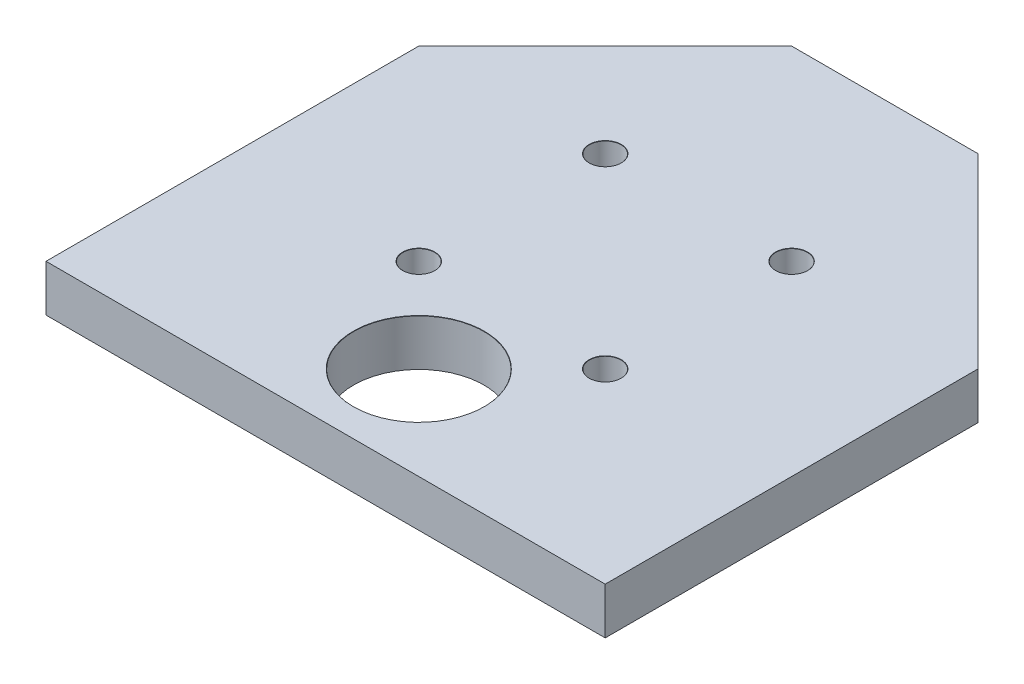
ISO-10303-21;
HEADER;
FILE_DESCRIPTION(('STEP AP214'),'2;1');
FILE_NAME('part.step','',(''),(''),'','','');
FILE_SCHEMA(('AUTOMOTIVE_DESIGN { 1 0 10303 214 1 1 1 1 }'));
ENDSEC;
DATA;
#1=APPLICATION_CONTEXT('core data for automotive mechanical design processes');
#2=APPLICATION_PROTOCOL_DEFINITION('international standard','automotive_design',2000,#1);
#3=PRODUCT_CONTEXT('',#1,'mechanical');
#4=PRODUCT('Part','Part','',(#3));
#5=PRODUCT_RELATED_PRODUCT_CATEGORY('part','',(#4));
#6=PRODUCT_DEFINITION_FORMATION('','',#4);
#7=PRODUCT_DEFINITION_CONTEXT('part definition',#1,'design');
#8=PRODUCT_DEFINITION('design','',#6,#7);
#9=PRODUCT_DEFINITION_SHAPE('','',#8);
#10=(LENGTH_UNIT() NAMED_UNIT(*) SI_UNIT(.MILLI.,.METRE.));
#11=(NAMED_UNIT(*) PLANE_ANGLE_UNIT() SI_UNIT($,.RADIAN.));
#12=(NAMED_UNIT(*) SI_UNIT($,.STERADIAN.) SOLID_ANGLE_UNIT());
#13=UNCERTAINTY_MEASURE_WITH_UNIT(LENGTH_MEASURE(1.E-05),#10,'distance_accuracy_value','');
#14=(GEOMETRIC_REPRESENTATION_CONTEXT(3) GLOBAL_UNCERTAINTY_ASSIGNED_CONTEXT((#13)) GLOBAL_UNIT_ASSIGNED_CONTEXT((#10,
#11,#12)) REPRESENTATION_CONTEXT('',''));
#15=CARTESIAN_POINT('',(0.,0.,0.));
#16=DIRECTION('',(0.,0.,1.));
#17=DIRECTION('',(1.,0.,0.));
#18=AXIS2_PLACEMENT_3D('',#15,#16,#17);
#19=CARTESIAN_POINT('',(-30.,5.,30.));
#20=DIRECTION('',(1.,0.,0.));
#21=DIRECTION('',(0.,0.,-1.));
#22=AXIS2_PLACEMENT_3D('',#19,#20,#21);
#23=PLANE('',#22);
#24=DIRECTION('',(0.,0.,1.));
#25=VECTOR('',#24,1.);
#26=CARTESIAN_POINT('',(-30.,0.,30.));
#27=LINE('',#26,#25);
#28=CARTESIAN_POINT('',(-30.,0.,-10.0000000000002));
#29=VERTEX_POINT('',#28);
#30=CARTESIAN_POINT('',(-30.,0.,30.));
#31=VERTEX_POINT('',#30);
#32=EDGE_CURVE('E135',#29,#31,#27,.T.);
#33=ORIENTED_EDGE('',*,*,#32,.T.);
#34=DIRECTION('',(0.,-1.,0.));
#35=VECTOR('',#34,1.);
#36=CARTESIAN_POINT('',(-30.,5.,30.));
#37=LINE('',#36,#35);
#38=CARTESIAN_POINT('',(-30.,5.,30.));
#39=VERTEX_POINT('',#38);
#40=EDGE_CURVE('E11',#39,#31,#37,.T.);
#41=ORIENTED_EDGE('',*,*,#40,.F.);
#42=DIRECTION('',(0.,0.,1.));
#43=VECTOR('',#42,1.);
#44=CARTESIAN_POINT('',(-30.,5.,30.));
#45=LINE('',#44,#43);
#46=CARTESIAN_POINT('',(-30.,5.,-10.0000000000002));
#47=VERTEX_POINT('',#46);
#48=EDGE_CURVE('E152',#47,#39,#45,.T.);
#49=ORIENTED_EDGE('',*,*,#48,.F.);
#50=DIRECTION('',(0.,-1.,0.));
#51=VECTOR('',#50,1.);
#52=CARTESIAN_POINT('',(-30.,5.,-10.0000000000002));
#53=LINE('',#52,#51);
#54=EDGE_CURVE('E131',#47,#29,#53,.T.);
#55=ORIENTED_EDGE('',*,*,#54,.T.);
#56=EDGE_LOOP('',(#33,#41,#49,#55));
#57=FACE_BOUND('',#56,.T.);
#58=ADVANCED_FACE('F42',(#57),#23,.F.);
#59=CARTESIAN_POINT('',(-30.,5.,30.));
#60=DIRECTION('',(0.,0.,-1.));
#61=DIRECTION('',(-1.,0.,0.));
#62=AXIS2_PLACEMENT_3D('',#59,#60,#61);
#63=PLANE('',#62);
#64=DIRECTION('',(1.,0.,0.));
#65=VECTOR('',#64,1.);
#66=CARTESIAN_POINT('',(-30.,0.,30.));
#67=LINE('',#66,#65);
#68=CARTESIAN_POINT('',(30.,0.,30.));
#69=VERTEX_POINT('',#68);
#70=EDGE_CURVE('E139',#31,#69,#67,.T.);
#71=ORIENTED_EDGE('',*,*,#70,.T.);
#72=DIRECTION('',(0.,-1.,0.));
#73=VECTOR('',#72,1.);
#74=CARTESIAN_POINT('',(30.,5.,30.));
#75=LINE('',#74,#73);
#76=CARTESIAN_POINT('',(30.,5.,30.));
#77=VERTEX_POINT('',#76);
#78=EDGE_CURVE('E51',#77,#69,#75,.T.);
#79=ORIENTED_EDGE('',*,*,#78,.F.);
#80=DIRECTION('',(1.,0.,0.));
#81=VECTOR('',#80,1.);
#82=CARTESIAN_POINT('',(-30.,5.,30.));
#83=LINE('',#82,#81);
#84=EDGE_CURVE('E97',#39,#77,#83,.T.);
#85=ORIENTED_EDGE('',*,*,#84,.F.);
#86=ORIENTED_EDGE('',*,*,#40,.T.);
#87=EDGE_LOOP('',(#71,#79,#85,#86));
#88=FACE_BOUND('',#87,.T.);
#89=ADVANCED_FACE('F184',(#88),#63,.F.);
#90=CARTESIAN_POINT('',(30.,5.,30.));
#91=DIRECTION('',(-1.,0.,0.));
#92=DIRECTION('',(0.,0.,1.));
#93=AXIS2_PLACEMENT_3D('',#90,#91,#92);
#94=PLANE('',#93);
#95=DIRECTION('',(0.,0.,-1.));
#96=VECTOR('',#95,1.);
#97=CARTESIAN_POINT('',(30.,0.,30.));
#98=LINE('',#97,#96);
#99=CARTESIAN_POINT('',(30.,0.,-10.0000000000002));
#100=VERTEX_POINT('',#99);
#101=EDGE_CURVE('E143',#69,#100,#98,.T.);
#102=ORIENTED_EDGE('',*,*,#101,.T.);
#103=DIRECTION('',(0.,-1.,0.));
#104=VECTOR('',#103,1.);
#105=CARTESIAN_POINT('',(30.,5.,-10.0000000000002));
#106=LINE('',#105,#104);
#107=CARTESIAN_POINT('',(30.,5.,-10.0000000000002));
#108=VERTEX_POINT('',#107);
#109=EDGE_CURVE('E123',#108,#100,#106,.T.);
#110=ORIENTED_EDGE('',*,*,#109,.F.);
#111=DIRECTION('',(0.,0.,-1.));
#112=VECTOR('',#111,1.);
#113=CARTESIAN_POINT('',(30.,5.,30.));
#114=LINE('',#113,#112);
#115=EDGE_CURVE('E112',#77,#108,#114,.T.);
#116=ORIENTED_EDGE('',*,*,#115,.F.);
#117=ORIENTED_EDGE('',*,*,#78,.T.);
#118=EDGE_LOOP('',(#102,#110,#116,#117));
#119=FACE_BOUND('',#118,.T.);
#120=ADVANCED_FACE('F163',(#119),#94,.F.);
#121=CARTESIAN_POINT('',(9.99999999999999,5.,-30.));
#122=DIRECTION('',(-0.707106781186544,0.,0.707106781186551));
#123=DIRECTION('',(0.707106781186551,0.,0.707106781186544));
#124=AXIS2_PLACEMENT_3D('',#121,#122,#123);
#125=PLANE('',#124);
#126=CARTESIAN_POINT('',(15.6568542494924,2.5,-24.3431457505076));
#127=DIRECTION('',(0.707106781186544,0.,-0.707106781186551));
#128=DIRECTION('',(-0.707106781186551,0.,-0.707106781186544));
#129=AXIS2_PLACEMENT_3D('',#126,#127,#128);
#130=CIRCLE('',#129,1.275);
#131=CARTESIAN_POINT('',(14.7552931034796,2.5,-25.2447068965205));
#132=VERTEX_POINT('',#131);
#133=EDGE_CURVE('E199',#132,#132,#130,.T.);
#134=ORIENTED_EDGE('',*,*,#133,.F.);
#135=EDGE_LOOP('',(#134));
#136=FACE_BOUND('',#135,.T.);
#137=DIRECTION('',(-0.707106781186551,0.,-0.707106781186544));
#138=VECTOR('',#137,1.);
#139=CARTESIAN_POINT('',(9.99999999999999,0.,-30.));
#140=LINE('',#139,#138);
#141=CARTESIAN_POINT('',(9.99999999999999,0.,-30.));
#142=VERTEX_POINT('',#141);
#143=EDGE_CURVE('E121',#100,#142,#140,.T.);
#144=ORIENTED_EDGE('',*,*,#143,.T.);
#145=DIRECTION('',(0.,-1.,0.));
#146=VECTOR('',#145,1.);
#147=CARTESIAN_POINT('',(9.99999999999999,5.,-30.));
#148=LINE('',#147,#146);
#149=CARTESIAN_POINT('',(9.99999999999999,5.,-30.));
#150=VERTEX_POINT('',#149);
#151=EDGE_CURVE('E118',#150,#142,#148,.T.);
#152=ORIENTED_EDGE('',*,*,#151,.F.);
#153=DIRECTION('',(-0.707106781186551,0.,-0.707106781186544));
#154=VECTOR('',#153,1.);
#155=CARTESIAN_POINT('',(9.99999999999999,5.,-30.));
#156=LINE('',#155,#154);
#157=EDGE_CURVE('E106',#108,#150,#156,.T.);
#158=ORIENTED_EDGE('',*,*,#157,.F.);
#159=ORIENTED_EDGE('',*,*,#109,.T.);
#160=EDGE_LOOP('',(#144,#152,#158,#159));
#161=FACE_BOUND('',#160,.T.);
#162=ADVANCED_FACE('F119',(#136,#161),#125,.F.);
#163=CARTESIAN_POINT('',(-10.,5.,-30.));
#164=DIRECTION('',(0.,0.,1.));
#165=DIRECTION('',(1.,0.,0.));
#166=AXIS2_PLACEMENT_3D('',#163,#164,#165);
#167=PLANE('',#166);
#168=DIRECTION('',(-1.,0.,0.));
#169=VECTOR('',#168,1.);
#170=CARTESIAN_POINT('',(-10.,0.,-30.));
#171=LINE('',#170,#169);
#172=CARTESIAN_POINT('',(-10.,0.,-30.));
#173=VERTEX_POINT('',#172);
#174=EDGE_CURVE('E83',#142,#173,#171,.T.);
#175=ORIENTED_EDGE('',*,*,#174,.T.);
#176=DIRECTION('',(0.,-1.,0.));
#177=VECTOR('',#176,1.);
#178=CARTESIAN_POINT('',(-10.,5.,-30.));
#179=LINE('',#178,#177);
#180=CARTESIAN_POINT('',(-10.,5.,-30.));
#181=VERTEX_POINT('',#180);
#182=EDGE_CURVE('E124',#181,#173,#179,.T.);
#183=ORIENTED_EDGE('',*,*,#182,.F.);
#184=DIRECTION('',(-1.,0.,0.));
#185=VECTOR('',#184,1.);
#186=CARTESIAN_POINT('',(-10.,5.,-30.));
#187=LINE('',#186,#185);
#188=EDGE_CURVE('E110',#150,#181,#187,.T.);
#189=ORIENTED_EDGE('',*,*,#188,.F.);
#190=ORIENTED_EDGE('',*,*,#151,.T.);
#191=EDGE_LOOP('',(#175,#183,#189,#190));
#192=FACE_BOUND('',#191,.T.);
#193=ADVANCED_FACE('F126',(#192),#167,.F.);
#194=CARTESIAN_POINT('',(-10.,5.,-30.));
#195=DIRECTION('',(0.707106781186544,0.,0.707106781186551));
#196=DIRECTION('',(0.707106781186551,0.,-0.707106781186544));
#197=AXIS2_PLACEMENT_3D('',#194,#195,#196);
#198=PLANE('',#197);
#199=CARTESIAN_POINT('',(-15.6568542494924,2.5,-24.3431457505076));
#200=DIRECTION('',(-0.707106781186544,0.,-0.707106781186551));
#201=DIRECTION('',(-0.707106781186551,0.,0.707106781186544));
#202=AXIS2_PLACEMENT_3D('',#199,#200,#201);
#203=CIRCLE('',#202,1.275);
#204=CARTESIAN_POINT('',(-16.5584153955053,2.5,-23.4415846044948));
#205=VERTEX_POINT('',#204);
#206=EDGE_CURVE('E231',#205,#205,#203,.T.);
#207=ORIENTED_EDGE('',*,*,#206,.F.);
#208=EDGE_LOOP('',(#207));
#209=FACE_BOUND('',#208,.T.);
#210=DIRECTION('',(-0.707106781186551,0.,0.707106781186544));
#211=VECTOR('',#210,1.);
#212=CARTESIAN_POINT('',(-10.,0.,-30.));
#213=LINE('',#212,#211);
#214=EDGE_CURVE('E89',#173,#29,#213,.T.);
#215=ORIENTED_EDGE('',*,*,#214,.T.);
#216=ORIENTED_EDGE('',*,*,#54,.F.);
#217=DIRECTION('',(-0.707106781186551,0.,0.707106781186544));
#218=VECTOR('',#217,1.);
#219=CARTESIAN_POINT('',(-10.,5.,-30.));
#220=LINE('',#219,#218);
#221=EDGE_CURVE('E59',#181,#47,#220,.T.);
#222=ORIENTED_EDGE('',*,*,#221,.F.);
#223=ORIENTED_EDGE('',*,*,#182,.T.);
#224=EDGE_LOOP('',(#215,#216,#222,#223));
#225=FACE_BOUND('',#224,.T.);
#226=ADVANCED_FACE('F170',(#209,#225),#198,.F.);
#227=CARTESIAN_POINT('',(0.,5.,0.));
#228=DIRECTION('',(0.,-1.,0.));
#229=DIRECTION('',(0.,0.,-1.));
#230=AXIS2_PLACEMENT_3D('',#227,#228,#229);
#231=PLANE('',#230);
#232=CARTESIAN_POINT('',(-10.,5.,-10.));
#233=DIRECTION('',(0.,1.,0.));
#234=DIRECTION('',(0.,0.,1.));
#235=AXIS2_PLACEMENT_3D('',#232,#233,#234);
#236=CIRCLE('',#235,1.725);
#237=CARTESIAN_POINT('',(-10.,5.,-8.275));
#238=VERTEX_POINT('',#237);
#239=EDGE_CURVE('E369',#238,#238,#236,.T.);
#240=ORIENTED_EDGE('',*,*,#239,.F.);
#241=EDGE_LOOP('',(#240));
#242=FACE_BOUND('',#241,.T.);
#243=CARTESIAN_POINT('',(10.,5.,-10.));
#244=DIRECTION('',(0.,1.,0.));
#245=DIRECTION('',(0.,0.,1.));
#246=AXIS2_PLACEMENT_3D('',#243,#244,#245);
#247=CIRCLE('',#246,1.725);
#248=CARTESIAN_POINT('',(10.,5.,-8.275));
#249=VERTEX_POINT('',#248);
#250=EDGE_CURVE('E378',#249,#249,#247,.T.);
#251=ORIENTED_EDGE('',*,*,#250,.F.);
#252=EDGE_LOOP('',(#251));
#253=FACE_BOUND('',#252,.T.);
#254=CARTESIAN_POINT('',(10.,5.,10.));
#255=DIRECTION('',(0.,1.,0.));
#256=DIRECTION('',(0.,0.,1.));
#257=AXIS2_PLACEMENT_3D('',#254,#255,#256);
#258=CIRCLE('',#257,1.725);
#259=CARTESIAN_POINT('',(10.,5.,11.725));
#260=VERTEX_POINT('',#259);
#261=EDGE_CURVE('E388',#260,#260,#258,.T.);
#262=ORIENTED_EDGE('',*,*,#261,.F.);
#263=EDGE_LOOP('',(#262));
#264=FACE_BOUND('',#263,.T.);
#265=CARTESIAN_POINT('',(-10.,5.,10.));
#266=DIRECTION('',(0.,1.,0.));
#267=DIRECTION('',(0.,0.,1.));
#268=AXIS2_PLACEMENT_3D('',#265,#266,#267);
#269=CIRCLE('',#268,1.725);
#270=CARTESIAN_POINT('',(-10.,5.,11.725));
#271=VERTEX_POINT('',#270);
#272=EDGE_CURVE('E398',#271,#271,#269,.T.);
#273=ORIENTED_EDGE('',*,*,#272,.F.);
#274=EDGE_LOOP('',(#273));
#275=FACE_BOUND('',#274,.T.);
#276=CARTESIAN_POINT('',(0.,5.,20.));
#277=DIRECTION('',(0.,1.,0.));
#278=DIRECTION('',(0.,0.,1.));
#279=AXIS2_PLACEMENT_3D('',#276,#277,#278);
#280=CIRCLE('',#279,7.025);
#281=CARTESIAN_POINT('',(0.,5.,27.025));
#282=VERTEX_POINT('',#281);
#283=EDGE_CURVE('E219',#282,#282,#280,.T.);
#284=ORIENTED_EDGE('',*,*,#283,.F.);
#285=EDGE_LOOP('',(#284));
#286=FACE_BOUND('',#285,.T.);
#287=ORIENTED_EDGE('',*,*,#48,.T.);
#288=ORIENTED_EDGE('',*,*,#84,.T.);
#289=ORIENTED_EDGE('',*,*,#115,.T.);
#290=ORIENTED_EDGE('',*,*,#157,.T.);
#291=ORIENTED_EDGE('',*,*,#188,.T.);
#292=ORIENTED_EDGE('',*,*,#221,.T.);
#293=EDGE_LOOP('',(#287,#288,#289,#290,#291,#292));
#294=FACE_BOUND('',#293,.T.);
#295=ADVANCED_FACE('F108',(#242,#253,#264,#275,#286,#294),#231,.F.);
#296=CARTESIAN_POINT('',(0.,0.,0.));
#297=DIRECTION('',(0.,-1.,0.));
#298=DIRECTION('',(0.,0.,-1.));
#299=AXIS2_PLACEMENT_3D('',#296,#297,#298);
#300=PLANE('',#299);
#301=CARTESIAN_POINT('',(-10.,0.,-10.));
#302=DIRECTION('',(0.,1.,0.));
#303=DIRECTION('',(0.,0.,1.));
#304=AXIS2_PLACEMENT_3D('',#301,#302,#303);
#305=CIRCLE('',#304,1.7);
#306=CARTESIAN_POINT('',(-10.,0.,-8.3));
#307=VERTEX_POINT('',#306);
#308=EDGE_CURVE('E296',#307,#307,#305,.T.);
#309=ORIENTED_EDGE('',*,*,#308,.T.);
#310=EDGE_LOOP('',(#309));
#311=FACE_BOUND('',#310,.T.);
#312=CARTESIAN_POINT('',(10.,0.,-10.));
#313=DIRECTION('',(0.,1.,0.));
#314=DIRECTION('',(0.,0.,1.));
#315=AXIS2_PLACEMENT_3D('',#312,#313,#314);
#316=CIRCLE('',#315,1.7);
#317=CARTESIAN_POINT('',(10.,0.,-8.3));
#318=VERTEX_POINT('',#317);
#319=EDGE_CURVE('E300',#318,#318,#316,.T.);
#320=ORIENTED_EDGE('',*,*,#319,.T.);
#321=EDGE_LOOP('',(#320));
#322=FACE_BOUND('',#321,.T.);
#323=CARTESIAN_POINT('',(10.,0.,10.));
#324=DIRECTION('',(0.,1.,0.));
#325=DIRECTION('',(0.,0.,1.));
#326=AXIS2_PLACEMENT_3D('',#323,#324,#325);
#327=CIRCLE('',#326,1.7);
#328=CARTESIAN_POINT('',(10.,0.,11.7));
#329=VERTEX_POINT('',#328);
#330=EDGE_CURVE('E304',#329,#329,#327,.T.);
#331=ORIENTED_EDGE('',*,*,#330,.T.);
#332=EDGE_LOOP('',(#331));
#333=FACE_BOUND('',#332,.T.);
#334=CARTESIAN_POINT('',(-10.,0.,10.));
#335=DIRECTION('',(0.,1.,0.));
#336=DIRECTION('',(0.,0.,1.));
#337=AXIS2_PLACEMENT_3D('',#334,#335,#336);
#338=CIRCLE('',#337,1.7);
#339=CARTESIAN_POINT('',(-10.,0.,11.7));
#340=VERTEX_POINT('',#339);
#341=EDGE_CURVE('E203',#340,#340,#338,.T.);
#342=ORIENTED_EDGE('',*,*,#341,.T.);
#343=EDGE_LOOP('',(#342));
#344=FACE_BOUND('',#343,.T.);
#345=CARTESIAN_POINT('',(0.,0.,20.));
#346=DIRECTION('',(0.,1.,0.));
#347=DIRECTION('',(0.,0.,1.));
#348=AXIS2_PLACEMENT_3D('',#345,#346,#347);
#349=CIRCLE('',#348,7.);
#350=CARTESIAN_POINT('',(0.,0.,27.));
#351=VERTEX_POINT('',#350);
#352=EDGE_CURVE('E227',#351,#351,#349,.T.);
#353=ORIENTED_EDGE('',*,*,#352,.T.);
#354=EDGE_LOOP('',(#353));
#355=FACE_BOUND('',#354,.T.);
#356=ORIENTED_EDGE('',*,*,#32,.F.);
#357=ORIENTED_EDGE('',*,*,#214,.F.);
#358=ORIENTED_EDGE('',*,*,#174,.F.);
#359=ORIENTED_EDGE('',*,*,#143,.F.);
#360=ORIENTED_EDGE('',*,*,#101,.F.);
#361=ORIENTED_EDGE('',*,*,#70,.F.);
#362=EDGE_LOOP('',(#356,#357,#358,#359,#360,#361));
#363=FACE_BOUND('',#362,.T.);
#364=ADVANCED_FACE('F166',(#311,#322,#333,#344,#355,#363),#300,.T.);
#365=CARTESIAN_POINT('',(-8.58578643762697,2.5,-17.2720779386421));
#366=DIRECTION('',(-0.707106781186544,0.,-0.707106781186551));
#367=DIRECTION('',(-0.707106781186551,0.,0.707106781186544));
#368=AXIS2_PLACEMENT_3D('',#365,#366,#367);
#369=CONICAL_SURFACE('',#368,1.24999999999997,1.02974425867665);
#370=CARTESIAN_POINT('',(-8.05469566479906,2.5,-16.7409871658142));
#371=VERTEX_POINT('',#370);
#372=VERTEX_LOOP('',#371);
#373=FACE_BOUND('',#372,.T.);
#374=CARTESIAN_POINT('',(-8.58578643762697,2.5,-17.2720779386421));
#375=DIRECTION('',(-0.707106781186544,0.,-0.707106781186551));
#376=DIRECTION('',(-0.707106781186551,0.,0.707106781186544));
#377=AXIS2_PLACEMENT_3D('',#374,#375,#376);
#378=CIRCLE('',#377,1.24999999999997);
#379=CARTESIAN_POINT('',(-9.46966991411014,2.5,-16.388194462159));
#380=VERTEX_POINT('',#379);
#381=EDGE_CURVE('E140',#380,#380,#378,.T.);
#382=ORIENTED_EDGE('',*,*,#381,.T.);
#383=EDGE_LOOP('',(#382));
#384=FACE_BOUND('',#383,.T.);
#385=ADVANCED_FACE('F266',(#373,#384),#369,.F.);
#386=CARTESIAN_POINT('',(-15.6568542494924,2.5,-24.3431457505076));
#387=DIRECTION('',(-0.707106781186544,0.,-0.707106781186551));
#388=DIRECTION('',(-0.707106781186551,0.,0.707106781186544));
#389=AXIS2_PLACEMENT_3D('',#386,#387,#388);
#390=CYLINDRICAL_SURFACE('',#389,1.24999999999997);
#391=ORIENTED_EDGE('',*,*,#381,.F.);
#392=EDGE_LOOP('',(#391));
#393=FACE_BOUND('',#392,.T.);
#394=CARTESIAN_POINT('',(-15.6391765799628,2.5,-24.325468080978));
#395=DIRECTION('',(-0.707106781186544,0.,-0.707106781186551));
#396=DIRECTION('',(-0.707106781186551,0.,0.707106781186544));
#397=AXIS2_PLACEMENT_3D('',#394,#395,#396);
#398=CIRCLE('',#397,1.24999999999997);
#399=CARTESIAN_POINT('',(-16.5230600564459,2.5,-23.4415846044948));
#400=VERTEX_POINT('',#399);
#401=EDGE_CURVE('E235',#400,#400,#398,.T.);
#402=ORIENTED_EDGE('',*,*,#401,.T.);
#403=EDGE_LOOP('',(#402));
#404=FACE_BOUND('',#403,.T.);
#405=ADVANCED_FACE('F268',(#393,#404),#390,.F.);
#406=CARTESIAN_POINT('',(-15.6568542494924,2.5,-24.3431457505076));
#407=DIRECTION('',(-0.707106781186544,0.,-0.707106781186551));
#408=DIRECTION('',(-0.707106781186551,0.,0.707106781186544));
#409=AXIS2_PLACEMENT_3D('',#406,#407,#408);
#410=CONICAL_SURFACE('',#409,1.275,0.785398163398035);
#411=ORIENTED_EDGE('',*,*,#401,.F.);
#412=EDGE_LOOP('',(#411));
#413=FACE_BOUND('',#412,.T.);
#414=ORIENTED_EDGE('',*,*,#206,.T.);
#415=EDGE_LOOP('',(#414));
#416=FACE_BOUND('',#415,.T.);
#417=ADVANCED_FACE('F271',(#413,#416),#410,.F.);
#418=CARTESIAN_POINT('',(0.,5.,20.));
#419=DIRECTION('',(0.,1.,0.));
#420=DIRECTION('',(0.,0.,1.));
#421=AXIS2_PLACEMENT_3D('',#418,#419,#420);
#422=CYLINDRICAL_SURFACE('',#421,7.);
#423=ORIENTED_EDGE('',*,*,#352,.F.);
#424=EDGE_LOOP('',(#423));
#425=FACE_BOUND('',#424,.T.);
#426=CARTESIAN_POINT('',(0.,4.975,20.));
#427=DIRECTION('',(0.,1.,0.));
#428=DIRECTION('',(0.,0.,1.));
#429=AXIS2_PLACEMENT_3D('',#426,#427,#428);
#430=CIRCLE('',#429,7.);
#431=CARTESIAN_POINT('',(0.,4.975,27.));
#432=VERTEX_POINT('',#431);
#433=EDGE_CURVE('E223',#432,#432,#430,.T.);
#434=ORIENTED_EDGE('',*,*,#433,.T.);
#435=EDGE_LOOP('',(#434));
#436=FACE_BOUND('',#435,.T.);
#437=ADVANCED_FACE('F277',(#425,#436),#422,.F.);
#438=CARTESIAN_POINT('',(0.,5.,20.));
#439=DIRECTION('',(0.,1.,0.));
#440=DIRECTION('',(0.,0.,1.));
#441=AXIS2_PLACEMENT_3D('',#438,#439,#440);
#442=CONICAL_SURFACE('',#441,7.025,0.785398163397466);
#443=ORIENTED_EDGE('',*,*,#433,.F.);
#444=EDGE_LOOP('',(#443));
#445=FACE_BOUND('',#444,.T.);
#446=ORIENTED_EDGE('',*,*,#283,.T.);
#447=EDGE_LOOP('',(#446));
#448=FACE_BOUND('',#447,.T.);
#449=ADVANCED_FACE('F282',(#445,#448),#442,.F.);
#450=CARTESIAN_POINT('',(8.58578643762697,2.5,-17.2720779386421));
#451=DIRECTION('',(0.707106781186544,0.,-0.707106781186551));
#452=DIRECTION('',(-0.707106781186551,0.,-0.707106781186544));
#453=AXIS2_PLACEMENT_3D('',#450,#451,#452);
#454=CONICAL_SURFACE('',#453,1.24999999999997,1.02974425867665);
#455=CARTESIAN_POINT('',(8.05469566479906,2.5,-16.7409871658142));
#456=VERTEX_POINT('',#455);
#457=VERTEX_LOOP('',#456);
#458=FACE_BOUND('',#457,.T.);
#459=CARTESIAN_POINT('',(8.58578643762697,2.5,-17.2720779386421));
#460=DIRECTION('',(0.707106781186544,0.,-0.707106781186551));
#461=DIRECTION('',(-0.707106781186551,0.,-0.707106781186544));
#462=AXIS2_PLACEMENT_3D('',#459,#460,#461);
#463=CIRCLE('',#462,1.24999999999997);
#464=CARTESIAN_POINT('',(7.7019029611438,2.5,-18.1559614151253));
#465=VERTEX_POINT('',#464);
#466=EDGE_CURVE('E209',#465,#465,#463,.T.);
#467=ORIENTED_EDGE('',*,*,#466,.T.);
#468=EDGE_LOOP('',(#467));
#469=FACE_BOUND('',#468,.T.);
#470=ADVANCED_FACE('F313',(#458,#469),#454,.F.);
#471=CARTESIAN_POINT('',(15.6568542494924,2.5,-24.3431457505076));
#472=DIRECTION('',(0.707106781186544,0.,-0.707106781186551));
#473=DIRECTION('',(-0.707106781186551,0.,-0.707106781186544));
#474=AXIS2_PLACEMENT_3D('',#471,#472,#473);
#475=CYLINDRICAL_SURFACE('',#474,1.24999999999997);
#476=ORIENTED_EDGE('',*,*,#466,.F.);
#477=EDGE_LOOP('',(#476));
#478=FACE_BOUND('',#477,.T.);
#479=CARTESIAN_POINT('',(15.6391765799628,2.5,-24.325468080978));
#480=DIRECTION('',(0.707106781186544,0.,-0.707106781186551));
#481=DIRECTION('',(-0.707106781186551,0.,-0.707106781186544));
#482=AXIS2_PLACEMENT_3D('',#479,#480,#481);
#483=CIRCLE('',#482,1.24999999999997);
#484=CARTESIAN_POINT('',(14.7552931034796,2.5,-25.2093515574611));
#485=VERTEX_POINT('',#484);
#486=EDGE_CURVE('E202',#485,#485,#483,.T.);
#487=ORIENTED_EDGE('',*,*,#486,.T.);
#488=EDGE_LOOP('',(#487));
#489=FACE_BOUND('',#488,.T.);
#490=ADVANCED_FACE('F319',(#478,#489),#475,.F.);
#491=CARTESIAN_POINT('',(15.6568542494924,2.5,-24.3431457505076));
#492=DIRECTION('',(0.707106781186544,0.,-0.707106781186551));
#493=DIRECTION('',(-0.707106781186551,0.,-0.707106781186544));
#494=AXIS2_PLACEMENT_3D('',#491,#492,#493);
#495=CONICAL_SURFACE('',#494,1.275,0.785398163398035);
#496=ORIENTED_EDGE('',*,*,#486,.F.);
#497=EDGE_LOOP('',(#496));
#498=FACE_BOUND('',#497,.T.);
#499=ORIENTED_EDGE('',*,*,#133,.T.);
#500=EDGE_LOOP('',(#499));
#501=FACE_BOUND('',#500,.T.);
#502=ADVANCED_FACE('F325',(#498,#501),#495,.F.);
#503=CARTESIAN_POINT('',(-10.,5.,10.));
#504=DIRECTION('',(0.,1.,0.));
#505=DIRECTION('',(0.,0.,1.));
#506=AXIS2_PLACEMENT_3D('',#503,#504,#505);
#507=CYLINDRICAL_SURFACE('',#506,1.7);
#508=ORIENTED_EDGE('',*,*,#341,.F.);
#509=EDGE_LOOP('',(#508));
#510=FACE_BOUND('',#509,.T.);
#511=CARTESIAN_POINT('',(-10.,4.975,10.));
#512=DIRECTION('',(0.,1.,0.));
#513=DIRECTION('',(0.,0.,1.));
#514=AXIS2_PLACEMENT_3D('',#511,#512,#513);
#515=CIRCLE('',#514,1.7);
#516=CARTESIAN_POINT('',(-10.,4.975,11.7));
#517=VERTEX_POINT('',#516);
#518=EDGE_CURVE('E212',#517,#517,#515,.T.);
#519=ORIENTED_EDGE('',*,*,#518,.T.);
#520=EDGE_LOOP('',(#519));
#521=FACE_BOUND('',#520,.T.);
#522=ADVANCED_FACE('F329',(#510,#521),#507,.F.);
#523=CARTESIAN_POINT('',(-10.,5.,10.));
#524=DIRECTION('',(0.,1.,0.));
#525=DIRECTION('',(0.,0.,1.));
#526=AXIS2_PLACEMENT_3D('',#523,#524,#525);
#527=CONICAL_SURFACE('',#526,1.725,0.785398163397379);
#528=ORIENTED_EDGE('',*,*,#518,.F.);
#529=EDGE_LOOP('',(#528));
#530=FACE_BOUND('',#529,.T.);
#531=ORIENTED_EDGE('',*,*,#272,.T.);
#532=EDGE_LOOP('',(#531));
#533=FACE_BOUND('',#532,.T.);
#534=ADVANCED_FACE('F333',(#530,#533),#527,.F.);
#535=CARTESIAN_POINT('',(10.,5.,10.));
#536=DIRECTION('',(0.,1.,0.));
#537=DIRECTION('',(0.,0.,1.));
#538=AXIS2_PLACEMENT_3D('',#535,#536,#537);
#539=CYLINDRICAL_SURFACE('',#538,1.7);
#540=ORIENTED_EDGE('',*,*,#330,.F.);
#541=EDGE_LOOP('',(#540));
#542=FACE_BOUND('',#541,.T.);
#543=CARTESIAN_POINT('',(10.,4.975,10.));
#544=DIRECTION('',(0.,1.,0.));
#545=DIRECTION('',(0.,0.,1.));
#546=AXIS2_PLACEMENT_3D('',#543,#544,#545);
#547=CIRCLE('',#546,1.7);
#548=CARTESIAN_POINT('',(10.,4.975,11.7));
#549=VERTEX_POINT('',#548);
#550=EDGE_CURVE('E392',#549,#549,#547,.T.);
#551=ORIENTED_EDGE('',*,*,#550,.T.);
#552=EDGE_LOOP('',(#551));
#553=FACE_BOUND('',#552,.T.);
#554=ADVANCED_FACE('F337',(#542,#553),#539,.F.);
#555=CARTESIAN_POINT('',(10.,5.,10.));
#556=DIRECTION('',(0.,1.,0.));
#557=DIRECTION('',(0.,0.,1.));
#558=AXIS2_PLACEMENT_3D('',#555,#556,#557);
#559=CONICAL_SURFACE('',#558,1.725,0.785398163397414);
#560=ORIENTED_EDGE('',*,*,#550,.F.);
#561=EDGE_LOOP('',(#560));
#562=FACE_BOUND('',#561,.T.);
#563=ORIENTED_EDGE('',*,*,#261,.T.);
#564=EDGE_LOOP('',(#563));
#565=FACE_BOUND('',#564,.T.);
#566=ADVANCED_FACE('F341',(#562,#565),#559,.F.);
#567=CARTESIAN_POINT('',(10.,5.,-10.));
#568=DIRECTION('',(0.,1.,0.));
#569=DIRECTION('',(0.,0.,1.));
#570=AXIS2_PLACEMENT_3D('',#567,#568,#569);
#571=CYLINDRICAL_SURFACE('',#570,1.7);
#572=ORIENTED_EDGE('',*,*,#319,.F.);
#573=EDGE_LOOP('',(#572));
#574=FACE_BOUND('',#573,.T.);
#575=CARTESIAN_POINT('',(10.,4.975,-10.));
#576=DIRECTION('',(0.,1.,0.));
#577=DIRECTION('',(0.,0.,1.));
#578=AXIS2_PLACEMENT_3D('',#575,#576,#577);
#579=CIRCLE('',#578,1.7);
#580=CARTESIAN_POINT('',(10.,4.975,-8.3));
#581=VERTEX_POINT('',#580);
#582=EDGE_CURVE('E382',#581,#581,#579,.T.);
#583=ORIENTED_EDGE('',*,*,#582,.T.);
#584=EDGE_LOOP('',(#583));
#585=FACE_BOUND('',#584,.T.);
#586=ADVANCED_FACE('F345',(#574,#585),#571,.F.);
#587=CARTESIAN_POINT('',(10.,5.,-10.));
#588=DIRECTION('',(0.,1.,0.));
#589=DIRECTION('',(0.,0.,1.));
#590=AXIS2_PLACEMENT_3D('',#587,#588,#589);
#591=CONICAL_SURFACE('',#590,1.725,0.785398163397414);
#592=ORIENTED_EDGE('',*,*,#582,.F.);
#593=EDGE_LOOP('',(#592));
#594=FACE_BOUND('',#593,.T.);
#595=ORIENTED_EDGE('',*,*,#250,.T.);
#596=EDGE_LOOP('',(#595));
#597=FACE_BOUND('',#596,.T.);
#598=ADVANCED_FACE('F349',(#594,#597),#591,.F.);
#599=CARTESIAN_POINT('',(-10.,5.,-10.));
#600=DIRECTION('',(0.,1.,0.));
#601=DIRECTION('',(0.,0.,1.));
#602=AXIS2_PLACEMENT_3D('',#599,#600,#601);
#603=CYLINDRICAL_SURFACE('',#602,1.7);
#604=ORIENTED_EDGE('',*,*,#308,.F.);
#605=EDGE_LOOP('',(#604));
#606=FACE_BOUND('',#605,.T.);
#607=CARTESIAN_POINT('',(-10.,4.975,-10.));
#608=DIRECTION('',(0.,1.,0.));
#609=DIRECTION('',(0.,0.,1.));
#610=AXIS2_PLACEMENT_3D('',#607,#608,#609);
#611=CIRCLE('',#610,1.7);
#612=CARTESIAN_POINT('',(-10.,4.975,-8.3));
#613=VERTEX_POINT('',#612);
#614=EDGE_CURVE('E366',#613,#613,#611,.T.);
#615=ORIENTED_EDGE('',*,*,#614,.T.);
#616=EDGE_LOOP('',(#615));
#617=FACE_BOUND('',#616,.T.);
#618=ADVANCED_FACE('F353',(#606,#617),#603,.F.);
#619=CARTESIAN_POINT('',(-10.,5.,-10.));
#620=DIRECTION('',(0.,1.,0.));
#621=DIRECTION('',(0.,0.,1.));
#622=AXIS2_PLACEMENT_3D('',#619,#620,#621);
#623=CONICAL_SURFACE('',#622,1.725,0.785398163397414);
#624=ORIENTED_EDGE('',*,*,#614,.F.);
#625=EDGE_LOOP('',(#624));
#626=FACE_BOUND('',#625,.T.);
#627=ORIENTED_EDGE('',*,*,#239,.T.);
#628=EDGE_LOOP('',(#627));
#629=FACE_BOUND('',#628,.T.);
#630=ADVANCED_FACE('F357',(#626,#629),#623,.F.);
#631=CLOSED_SHELL('',(#58,#89,#120,#162,#193,#226,#295,#364,#385,#405,#417,#437,#449,#470,#490,
#502,#522,#534,#554,#566,#586,#598,#618,#630));
#632=MANIFOLD_SOLID_BREP('B2',#631);
#633=ADVANCED_BREP_SHAPE_REPRESENTATION('',(#18,#632),#14);
#634=SHAPE_DEFINITION_REPRESENTATION(#9,#633);
ENDSEC;
END-ISO-10303-21;
